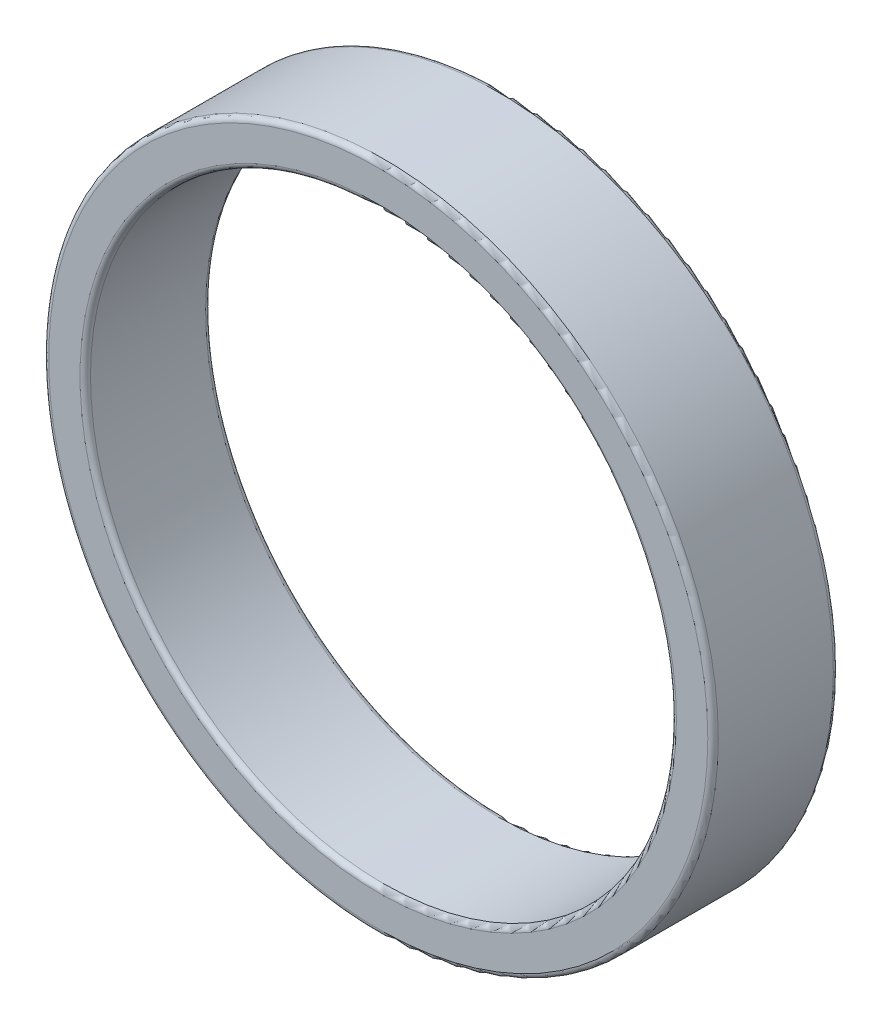
ISO-10303-21;
HEADER;
FILE_DESCRIPTION(('STEP AP214'),'2;1');
FILE_NAME('part.step','',(''),(''),'','','');
FILE_SCHEMA(('AUTOMOTIVE_DESIGN { 1 0 10303 214 1 1 1 1 }'));
ENDSEC;
DATA;
#1=APPLICATION_CONTEXT('core data for automotive mechanical design processes');
#2=APPLICATION_PROTOCOL_DEFINITION('international standard','automotive_design',2000,#1);
#3=PRODUCT_CONTEXT('',#1,'mechanical');
#4=PRODUCT('Part','Part','',(#3));
#5=PRODUCT_RELATED_PRODUCT_CATEGORY('part','',(#4));
#6=PRODUCT_DEFINITION_FORMATION('','',#4);
#7=PRODUCT_DEFINITION_CONTEXT('part definition',#1,'design');
#8=PRODUCT_DEFINITION('design','',#6,#7);
#9=PRODUCT_DEFINITION_SHAPE('','',#8);
#10=(LENGTH_UNIT() NAMED_UNIT(*) SI_UNIT(.MILLI.,.METRE.));
#11=(NAMED_UNIT(*) PLANE_ANGLE_UNIT() SI_UNIT($,.RADIAN.));
#12=(NAMED_UNIT(*) SI_UNIT($,.STERADIAN.) SOLID_ANGLE_UNIT());
#13=UNCERTAINTY_MEASURE_WITH_UNIT(LENGTH_MEASURE(1.E-05),#10,'distance_accuracy_value','');
#14=(GEOMETRIC_REPRESENTATION_CONTEXT(3) GLOBAL_UNCERTAINTY_ASSIGNED_CONTEXT((#13)) GLOBAL_UNIT_ASSIGNED_CONTEXT((#10,
#11,#12)) REPRESENTATION_CONTEXT('',''));
#15=CARTESIAN_POINT('',(0.,0.,0.));
#16=DIRECTION('',(0.,0.,1.));
#17=DIRECTION('',(1.,0.,0.));
#18=AXIS2_PLACEMENT_3D('',#15,#16,#17);
#19=CARTESIAN_POINT('',(0.,0.,6.));
#20=DIRECTION('',(0.,0.,1.));
#21=DIRECTION('',(1.,0.,0.));
#22=AXIS2_PLACEMENT_3D('',#19,#20,#21);
#23=PLANE('',#22);
#24=CARTESIAN_POINT('',(0.,0.,6.));
#25=DIRECTION('',(0.,0.,1.));
#26=DIRECTION('',(1.,0.,0.));
#27=AXIS2_PLACEMENT_3D('',#24,#25,#26);
#28=CIRCLE('',#27,14.25);
#29=CARTESIAN_POINT('',(14.25,0.,6.));
#30=VERTEX_POINT('',#29);
#31=EDGE_CURVE('E11',#30,#30,#28,.F.);
#32=ORIENTED_EDGE('',*,*,#31,.T.);
#33=EDGE_LOOP('',(#32));
#34=FACE_BOUND('',#33,.T.);
#35=CARTESIAN_POINT('',(0.,0.,6.));
#36=DIRECTION('',(0.,0.,1.));
#37=DIRECTION('',(1.,0.,0.));
#38=AXIS2_PLACEMENT_3D('',#35,#36,#37);
#39=CIRCLE('',#38,15.75);
#40=CARTESIAN_POINT('',(15.75,0.,6.));
#41=VERTEX_POINT('',#40);
#42=EDGE_CURVE('E45',#41,#41,#39,.T.);
#43=ORIENTED_EDGE('',*,*,#42,.T.);
#44=EDGE_LOOP('',(#43));
#45=FACE_BOUND('',#44,.T.);
#46=ADVANCED_FACE('F38',(#34,#45),#23,.T.);
#47=CARTESIAN_POINT('',(0.,0.,0.));
#48=DIRECTION('',(0.,0.,1.));
#49=DIRECTION('',(1.,0.,0.));
#50=AXIS2_PLACEMENT_3D('',#47,#48,#49);
#51=PLANE('',#50);
#52=CARTESIAN_POINT('',(0.,0.,0.));
#53=DIRECTION('',(0.,0.,1.));
#54=DIRECTION('',(1.,0.,0.));
#55=AXIS2_PLACEMENT_3D('',#52,#53,#54);
#56=CIRCLE('',#55,14.25);
#57=CARTESIAN_POINT('',(14.25,0.,0.));
#58=VERTEX_POINT('',#57);
#59=EDGE_CURVE('E64',#58,#58,#56,.T.);
#60=ORIENTED_EDGE('',*,*,#59,.T.);
#61=EDGE_LOOP('',(#60));
#62=FACE_BOUND('',#61,.T.);
#63=CARTESIAN_POINT('',(0.,0.,0.));
#64=DIRECTION('',(0.,0.,1.));
#65=DIRECTION('',(1.,0.,0.));
#66=AXIS2_PLACEMENT_3D('',#63,#64,#65);
#67=CIRCLE('',#66,15.75);
#68=CARTESIAN_POINT('',(15.75,0.,0.));
#69=VERTEX_POINT('',#68);
#70=EDGE_CURVE('E67',#69,#69,#67,.F.);
#71=ORIENTED_EDGE('',*,*,#70,.T.);
#72=EDGE_LOOP('',(#71));
#73=FACE_BOUND('',#72,.T.);
#74=ADVANCED_FACE('F71',(#62,#73),#51,.F.);
#75=CARTESIAN_POINT('',(0.,0.,6.));
#76=DIRECTION('',(0.,0.,-1.));
#77=DIRECTION('',(-1.,0.,0.));
#78=AXIS2_PLACEMENT_3D('',#75,#76,#77);
#79=CYLINDRICAL_SURFACE('',#78,16.);
#80=CARTESIAN_POINT('',(0.,0.,0.25));
#81=DIRECTION('',(0.,0.,1.));
#82=DIRECTION('',(1.,0.,0.));
#83=AXIS2_PLACEMENT_3D('',#80,#81,#82);
#84=CIRCLE('',#83,16.);
#85=CARTESIAN_POINT('',(16.,0.,0.25));
#86=VERTEX_POINT('',#85);
#87=EDGE_CURVE('E49',#86,#86,#84,.T.);
#88=ORIENTED_EDGE('',*,*,#87,.T.);
#89=EDGE_LOOP('',(#88));
#90=FACE_BOUND('',#89,.T.);
#91=CARTESIAN_POINT('',(0.,0.,5.75));
#92=DIRECTION('',(0.,0.,1.));
#93=DIRECTION('',(1.,0.,0.));
#94=AXIS2_PLACEMENT_3D('',#91,#92,#93);
#95=CIRCLE('',#94,16.);
#96=CARTESIAN_POINT('',(16.,0.,5.75));
#97=VERTEX_POINT('',#96);
#98=EDGE_CURVE('E53',#97,#97,#95,.F.);
#99=ORIENTED_EDGE('',*,*,#98,.T.);
#100=EDGE_LOOP('',(#99));
#101=FACE_BOUND('',#100,.T.);
#102=ADVANCED_FACE('F81',(#90,#101),#79,.T.);
#103=CARTESIAN_POINT('',(0.,0.,6.));
#104=DIRECTION('',(0.,0.,-1.));
#105=DIRECTION('',(-1.,0.,0.));
#106=AXIS2_PLACEMENT_3D('',#103,#104,#105);
#107=CYLINDRICAL_SURFACE('',#106,14.);
#108=CARTESIAN_POINT('',(0.,0.,0.25));
#109=DIRECTION('',(0.,0.,1.));
#110=DIRECTION('',(1.,0.,0.));
#111=AXIS2_PLACEMENT_3D('',#108,#109,#110);
#112=CIRCLE('',#111,14.);
#113=CARTESIAN_POINT('',(14.,0.,0.25));
#114=VERTEX_POINT('',#113);
#115=EDGE_CURVE('E58',#114,#114,#112,.F.);
#116=ORIENTED_EDGE('',*,*,#115,.T.);
#117=EDGE_LOOP('',(#116));
#118=FACE_BOUND('',#117,.T.);
#119=CARTESIAN_POINT('',(0.,0.,5.75));
#120=DIRECTION('',(0.,0.,1.));
#121=DIRECTION('',(1.,0.,0.));
#122=AXIS2_PLACEMENT_3D('',#119,#120,#121);
#123=CIRCLE('',#122,14.);
#124=CARTESIAN_POINT('',(14.,0.,5.75));
#125=VERTEX_POINT('',#124);
#126=EDGE_CURVE('E61',#125,#125,#123,.T.);
#127=ORIENTED_EDGE('',*,*,#126,.T.);
#128=EDGE_LOOP('',(#127));
#129=FACE_BOUND('',#128,.T.);
#130=ADVANCED_FACE('F84',(#118,#129),#107,.F.);
#131=CARTESIAN_POINT('',(0.,0.,0.25));
#132=DIRECTION('',(0.,0.,1.));
#133=DIRECTION('',(1.,0.,0.));
#134=AXIS2_PLACEMENT_3D('',#131,#132,#133);
#135=TOROIDAL_SURFACE('',#134,14.25,0.25);
#136=ORIENTED_EDGE('',*,*,#115,.F.);
#137=EDGE_LOOP('',(#136));
#138=FACE_BOUND('',#137,.T.);
#139=ORIENTED_EDGE('',*,*,#59,.F.);
#140=EDGE_LOOP('',(#139));
#141=FACE_BOUND('',#140,.T.);
#142=ADVANCED_FACE('F77',(#138,#141),#135,.T.);
#143=CARTESIAN_POINT('',(0.,0.,0.25));
#144=DIRECTION('',(0.,0.,1.));
#145=DIRECTION('',(1.,0.,0.));
#146=AXIS2_PLACEMENT_3D('',#143,#144,#145);
#147=TOROIDAL_SURFACE('',#146,15.75,0.25);
#148=ORIENTED_EDGE('',*,*,#70,.F.);
#149=EDGE_LOOP('',(#148));
#150=FACE_BOUND('',#149,.T.);
#151=ORIENTED_EDGE('',*,*,#87,.F.);
#152=EDGE_LOOP('',(#151));
#153=FACE_BOUND('',#152,.T.);
#154=ADVANCED_FACE('F73',(#150,#153),#147,.T.);
#155=CARTESIAN_POINT('',(0.,0.,5.75));
#156=DIRECTION('',(0.,0.,1.));
#157=DIRECTION('',(1.,0.,0.));
#158=AXIS2_PLACEMENT_3D('',#155,#156,#157);
#159=TOROIDAL_SURFACE('',#158,14.25,0.25);
#160=ORIENTED_EDGE('',*,*,#31,.F.);
#161=EDGE_LOOP('',(#160));
#162=FACE_BOUND('',#161,.T.);
#163=ORIENTED_EDGE('',*,*,#126,.F.);
#164=EDGE_LOOP('',(#163));
#165=FACE_BOUND('',#164,.T.);
#166=ADVANCED_FACE('F76',(#162,#165),#159,.T.);
#167=CARTESIAN_POINT('',(0.,0.,5.75));
#168=DIRECTION('',(0.,0.,1.));
#169=DIRECTION('',(1.,0.,0.));
#170=AXIS2_PLACEMENT_3D('',#167,#168,#169);
#171=TOROIDAL_SURFACE('',#170,15.75,0.25);
#172=ORIENTED_EDGE('',*,*,#98,.F.);
#173=EDGE_LOOP('',(#172));
#174=FACE_BOUND('',#173,.T.);
#175=ORIENTED_EDGE('',*,*,#42,.F.);
#176=EDGE_LOOP('',(#175));
#177=FACE_BOUND('',#176,.T.);
#178=ADVANCED_FACE('F40',(#174,#177),#171,.T.);
#179=CLOSED_SHELL('',(#46,#74,#102,#130,#142,#154,#166,#178));
#180=MANIFOLD_SOLID_BREP('B2',#179);
#181=ADVANCED_BREP_SHAPE_REPRESENTATION('',(#18,#180),#14);
#182=SHAPE_DEFINITION_REPRESENTATION(#9,#181);
ENDSEC;
END-ISO-10303-21;
